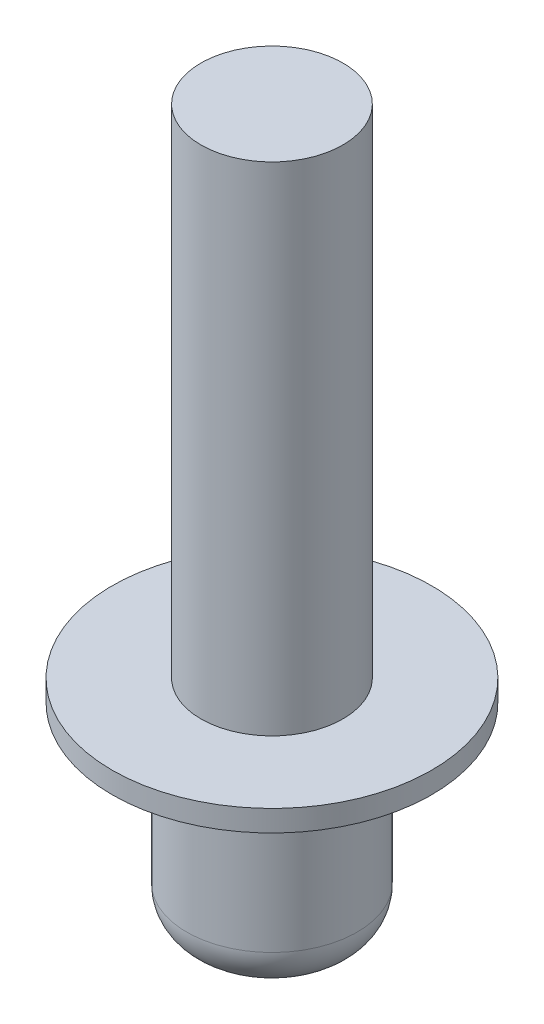
ISO-10303-21;
HEADER;
FILE_DESCRIPTION(('STEP AP214'),'2;1');
FILE_NAME('part.step','',(''),(''),'','','');
FILE_SCHEMA(('AUTOMOTIVE_DESIGN { 1 0 10303 214 1 1 1 1 }'));
ENDSEC;
DATA;
#1=APPLICATION_CONTEXT('core data for automotive mechanical design processes');
#2=APPLICATION_PROTOCOL_DEFINITION('international standard','automotive_design',2000,#1);
#3=PRODUCT_CONTEXT('',#1,'mechanical');
#4=PRODUCT('Part','Part','',(#3));
#5=PRODUCT_RELATED_PRODUCT_CATEGORY('part','',(#4));
#6=PRODUCT_DEFINITION_FORMATION('','',#4);
#7=PRODUCT_DEFINITION_CONTEXT('part definition',#1,'design');
#8=PRODUCT_DEFINITION('design','',#6,#7);
#9=PRODUCT_DEFINITION_SHAPE('','',#8);
#10=(LENGTH_UNIT() NAMED_UNIT(*) SI_UNIT(.MILLI.,.METRE.));
#11=(NAMED_UNIT(*) PLANE_ANGLE_UNIT() SI_UNIT($,.RADIAN.));
#12=(NAMED_UNIT(*) SI_UNIT($,.STERADIAN.) SOLID_ANGLE_UNIT());
#13=UNCERTAINTY_MEASURE_WITH_UNIT(LENGTH_MEASURE(1.E-05),#10,'distance_accuracy_value','');
#14=(GEOMETRIC_REPRESENTATION_CONTEXT(3) GLOBAL_UNCERTAINTY_ASSIGNED_CONTEXT((#13)) GLOBAL_UNIT_ASSIGNED_CONTEXT((#10,
#11,#12)) REPRESENTATION_CONTEXT('',''));
#15=CARTESIAN_POINT('',(0.,0.,0.));
#16=DIRECTION('',(0.,0.,1.));
#17=DIRECTION('',(1.,0.,0.));
#18=AXIS2_PLACEMENT_3D('',#15,#16,#17);
#19=CARTESIAN_POINT('',(0.,3.,0.));
#20=DIRECTION('',(0.,-1.,0.));
#21=DIRECTION('',(0.,0.,-1.));
#22=AXIS2_PLACEMENT_3D('',#19,#20,#21);
#23=CYLINDRICAL_SURFACE('',#22,22.5);
#24=CARTESIAN_POINT('',(0.,3.,0.));
#25=DIRECTION('',(0.,1.,0.));
#26=DIRECTION('',(0.,0.,1.));
#27=AXIS2_PLACEMENT_3D('',#24,#25,#26);
#28=CIRCLE('',#27,22.5);
#29=CARTESIAN_POINT('',(0.,3.,22.5));
#30=VERTEX_POINT('',#29);
#31=EDGE_CURVE('E56',#30,#30,#28,.T.);
#32=ORIENTED_EDGE('',*,*,#31,.F.);
#33=EDGE_LOOP('',(#32));
#34=FACE_BOUND('',#33,.T.);
#35=CARTESIAN_POINT('',(0.,0.,0.));
#36=DIRECTION('',(0.,1.,0.));
#37=DIRECTION('',(0.,0.,1.));
#38=AXIS2_PLACEMENT_3D('',#35,#36,#37);
#39=CIRCLE('',#38,22.5);
#40=CARTESIAN_POINT('',(0.,0.,22.5));
#41=VERTEX_POINT('',#40);
#42=EDGE_CURVE('E53',#41,#41,#39,.T.);
#43=ORIENTED_EDGE('',*,*,#42,.T.);
#44=EDGE_LOOP('',(#43));
#45=FACE_BOUND('',#44,.T.);
#46=ADVANCED_FACE('F35',(#34,#45),#23,.T.);
#47=CARTESIAN_POINT('',(0.,3.,0.));
#48=DIRECTION('',(0.,1.,0.));
#49=DIRECTION('',(0.,0.,1.));
#50=AXIS2_PLACEMENT_3D('',#47,#48,#49);
#51=PLANE('',#50);
#52=CARTESIAN_POINT('',(0.,3.,0.));
#53=DIRECTION('',(0.,1.,0.));
#54=DIRECTION('',(0.,0.,1.));
#55=AXIS2_PLACEMENT_3D('',#52,#53,#54);
#56=CIRCLE('',#55,10.);
#57=CARTESIAN_POINT('',(0.,3.,10.));
#58=VERTEX_POINT('',#57);
#59=EDGE_CURVE('E50',#58,#58,#56,.T.);
#60=ORIENTED_EDGE('',*,*,#59,.F.);
#61=EDGE_LOOP('',(#60));
#62=FACE_BOUND('',#61,.T.);
#63=ORIENTED_EDGE('',*,*,#31,.T.);
#64=EDGE_LOOP('',(#63));
#65=FACE_BOUND('',#64,.T.);
#66=ADVANCED_FACE('F74',(#62,#65),#51,.T.);
#67=CARTESIAN_POINT('',(0.,0.,0.));
#68=DIRECTION('',(0.,1.,0.));
#69=DIRECTION('',(0.,0.,1.));
#70=AXIS2_PLACEMENT_3D('',#67,#68,#69);
#71=PLANE('',#70);
#72=CARTESIAN_POINT('',(0.,0.,0.));
#73=DIRECTION('',(0.,-1.,0.));
#74=DIRECTION('',(0.,0.,-1.));
#75=AXIS2_PLACEMENT_3D('',#72,#73,#74);
#76=CIRCLE('',#75,12.);
#77=CARTESIAN_POINT('',(0.,0.,-12.));
#78=VERTEX_POINT('',#77);
#79=EDGE_CURVE('E46',#78,#78,#76,.T.);
#80=ORIENTED_EDGE('',*,*,#79,.F.);
#81=EDGE_LOOP('',(#80));
#82=FACE_BOUND('',#81,.T.);
#83=ORIENTED_EDGE('',*,*,#42,.F.);
#84=EDGE_LOOP('',(#83));
#85=FACE_BOUND('',#84,.T.);
#86=ADVANCED_FACE('F70',(#82,#85),#71,.F.);
#87=CARTESIAN_POINT('',(0.,73.,0.));
#88=DIRECTION('',(0.,-1.,0.));
#89=DIRECTION('',(0.,0.,-1.));
#90=AXIS2_PLACEMENT_3D('',#87,#88,#89);
#91=CYLINDRICAL_SURFACE('',#90,10.);
#92=CARTESIAN_POINT('',(0.,73.,0.));
#93=DIRECTION('',(0.,1.,0.));
#94=DIRECTION('',(0.,0.,1.));
#95=AXIS2_PLACEMENT_3D('',#92,#93,#94);
#96=CIRCLE('',#95,10.);
#97=CARTESIAN_POINT('',(0.,73.,10.));
#98=VERTEX_POINT('',#97);
#99=EDGE_CURVE('E57',#98,#98,#96,.T.);
#100=ORIENTED_EDGE('',*,*,#99,.F.);
#101=EDGE_LOOP('',(#100));
#102=FACE_BOUND('',#101,.T.);
#103=ORIENTED_EDGE('',*,*,#59,.T.);
#104=EDGE_LOOP('',(#103));
#105=FACE_BOUND('',#104,.T.);
#106=ADVANCED_FACE('F67',(#102,#105),#91,.T.);
#107=CARTESIAN_POINT('',(0.,73.,0.));
#108=DIRECTION('',(0.,1.,0.));
#109=DIRECTION('',(0.,0.,1.));
#110=AXIS2_PLACEMENT_3D('',#107,#108,#109);
#111=PLANE('',#110);
#112=ORIENTED_EDGE('',*,*,#99,.T.);
#113=EDGE_LOOP('',(#112));
#114=FACE_BOUND('',#113,.T.);
#115=ADVANCED_FACE('F65',(#114),#111,.T.);
#116=CARTESIAN_POINT('',(0.,-28.,0.));
#117=DIRECTION('',(0.,1.,0.));
#118=DIRECTION('',(0.,0.,1.));
#119=AXIS2_PLACEMENT_3D('',#116,#117,#118);
#120=CYLINDRICAL_SURFACE('',#119,12.);
#121=CARTESIAN_POINT('',(0.,-22.,0.));
#122=DIRECTION('',(0.,-1.,0.));
#123=DIRECTION('',(0.,0.,-1.));
#124=AXIS2_PLACEMENT_3D('',#121,#122,#123);
#125=CIRCLE('',#124,12.);
#126=CARTESIAN_POINT('',(0.,-22.,-12.));
#127=VERTEX_POINT('',#126);
#128=EDGE_CURVE('E10',#127,#127,#125,.F.);
#129=ORIENTED_EDGE('',*,*,#128,.T.);
#130=EDGE_LOOP('',(#129));
#131=FACE_BOUND('',#130,.T.);
#132=ORIENTED_EDGE('',*,*,#79,.T.);
#133=EDGE_LOOP('',(#132));
#134=FACE_BOUND('',#133,.T.);
#135=ADVANCED_FACE('F93',(#131,#134),#120,.T.);
#136=CARTESIAN_POINT('',(0.,-28.,0.));
#137=DIRECTION('',(0.,-1.,0.));
#138=DIRECTION('',(0.,0.,-1.));
#139=AXIS2_PLACEMENT_3D('',#136,#137,#138);
#140=PLANE('',#139);
#141=CARTESIAN_POINT('',(0.,-28.,0.));
#142=DIRECTION('',(0.,-1.,0.));
#143=DIRECTION('',(0.,0.,-1.));
#144=AXIS2_PLACEMENT_3D('',#141,#142,#143);
#145=CIRCLE('',#144,6.);
#146=CARTESIAN_POINT('',(0.,-28.,-6.));
#147=VERTEX_POINT('',#146);
#148=EDGE_CURVE('E42',#147,#147,#145,.T.);
#149=ORIENTED_EDGE('',*,*,#148,.T.);
#150=EDGE_LOOP('',(#149));
#151=FACE_BOUND('',#150,.T.);
#152=ADVANCED_FACE('F96',(#151),#140,.T.);
#153=CARTESIAN_POINT('',(0.,-22.,0.));
#154=DIRECTION('',(0.,-1.,0.));
#155=DIRECTION('',(0.,0.,-1.));
#156=AXIS2_PLACEMENT_3D('',#153,#154,#155);
#157=TOROIDAL_SURFACE('',#156,6.,6.);
#158=ORIENTED_EDGE('',*,*,#128,.F.);
#159=EDGE_LOOP('',(#158));
#160=FACE_BOUND('',#159,.T.);
#161=ORIENTED_EDGE('',*,*,#148,.F.);
#162=EDGE_LOOP('',(#161));
#163=FACE_BOUND('',#162,.T.);
#164=ADVANCED_FACE('F37',(#160,#163),#157,.T.);
#165=CLOSED_SHELL('',(#46,#66,#86,#106,#115,#135,#152,#164));
#166=MANIFOLD_SOLID_BREP('B2',#165);
#167=ADVANCED_BREP_SHAPE_REPRESENTATION('',(#18,#166),#14);
#168=SHAPE_DEFINITION_REPRESENTATION(#9,#167);
ENDSEC;
END-ISO-10303-21;
